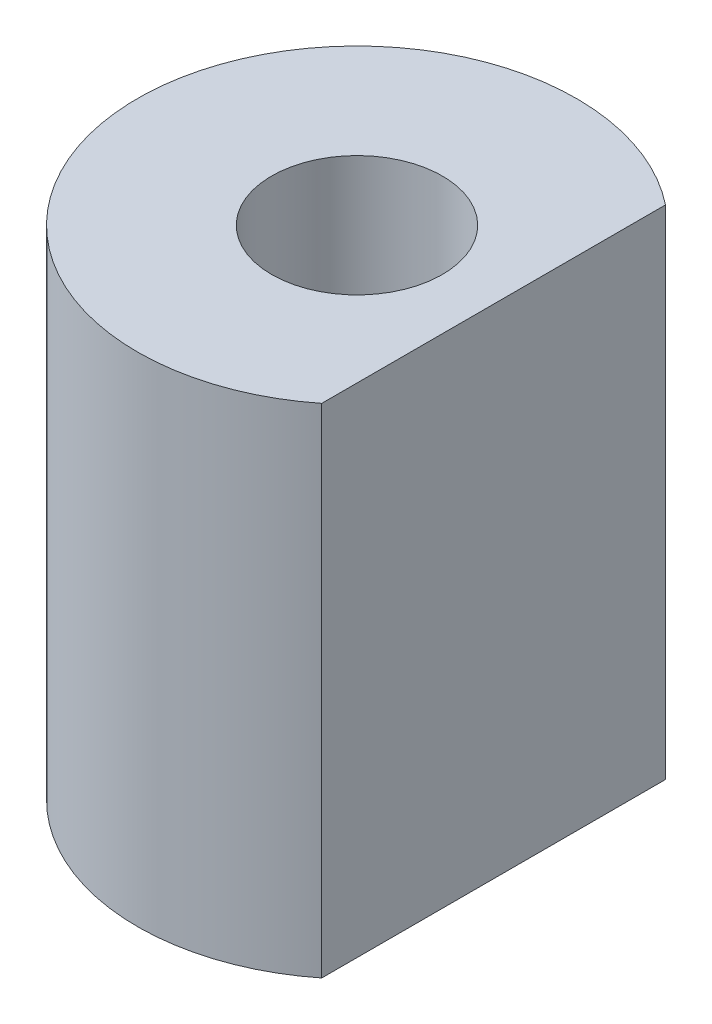
ISO-10303-21;
HEADER;
FILE_DESCRIPTION(('STEP AP214'),'2;1');
FILE_NAME('part.step','',(''),(''),'','','');
FILE_SCHEMA(('AUTOMOTIVE_DESIGN { 1 0 10303 214 1 1 1 1 }'));
ENDSEC;
DATA;
#1=APPLICATION_CONTEXT('core data for automotive mechanical design processes');
#2=APPLICATION_PROTOCOL_DEFINITION('international standard','automotive_design',2000,#1);
#3=PRODUCT_CONTEXT('',#1,'mechanical');
#4=PRODUCT('Part','Part','',(#3));
#5=PRODUCT_RELATED_PRODUCT_CATEGORY('part','',(#4));
#6=PRODUCT_DEFINITION_FORMATION('','',#4);
#7=PRODUCT_DEFINITION_CONTEXT('part definition',#1,'design');
#8=PRODUCT_DEFINITION('design','',#6,#7);
#9=PRODUCT_DEFINITION_SHAPE('','',#8);
#10=(LENGTH_UNIT() NAMED_UNIT(*) SI_UNIT(.MILLI.,.METRE.));
#11=(NAMED_UNIT(*) PLANE_ANGLE_UNIT() SI_UNIT($,.RADIAN.));
#12=(NAMED_UNIT(*) SI_UNIT($,.STERADIAN.) SOLID_ANGLE_UNIT());
#13=UNCERTAINTY_MEASURE_WITH_UNIT(LENGTH_MEASURE(1.E-05),#10,'distance_accuracy_value','');
#14=(GEOMETRIC_REPRESENTATION_CONTEXT(3) GLOBAL_UNCERTAINTY_ASSIGNED_CONTEXT((#13)) GLOBAL_UNIT_ASSIGNED_CONTEXT((#10,
#11,#12)) REPRESENTATION_CONTEXT('',''));
#15=CARTESIAN_POINT('',(0.,0.,0.));
#16=DIRECTION('',(0.,0.,1.));
#17=DIRECTION('',(1.,0.,0.));
#18=AXIS2_PLACEMENT_3D('',#15,#16,#17);
#19=CARTESIAN_POINT('',(2.8,10.2,0.));
#20=DIRECTION('',(1.,0.,0.));
#21=DIRECTION('',(0.,0.,-1.));
#22=AXIS2_PLACEMENT_3D('',#19,#20,#21);
#23=PLANE('',#22);
#24=DIRECTION('',(0.,0.,1.));
#25=VECTOR('',#24,1.);
#26=CARTESIAN_POINT('',(2.8,0.,0.));
#27=LINE('',#26,#25);
#28=CARTESIAN_POINT('',(2.8,0.,-3.52278299076171));
#29=VERTEX_POINT('',#28);
#30=CARTESIAN_POINT('',(2.8,0.,3.52278299076171));
#31=VERTEX_POINT('',#30);
#32=EDGE_CURVE('E70',#29,#31,#27,.T.);
#33=ORIENTED_EDGE('',*,*,#32,.F.);
#34=DIRECTION('',(0.,-1.,0.));
#35=VECTOR('',#34,1.);
#36=CARTESIAN_POINT('',(2.8,10.2,-3.52278299076171));
#37=LINE('',#36,#35);
#38=CARTESIAN_POINT('',(2.8,10.2,-3.52278299076171));
#39=VERTEX_POINT('',#38);
#40=EDGE_CURVE('E11',#39,#29,#37,.T.);
#41=ORIENTED_EDGE('',*,*,#40,.F.);
#42=DIRECTION('',(0.,0.,1.));
#43=VECTOR('',#42,1.);
#44=CARTESIAN_POINT('',(2.8,10.2,0.));
#45=LINE('',#44,#43);
#46=CARTESIAN_POINT('',(2.8,10.2,3.52278299076171));
#47=VERTEX_POINT('',#46);
#48=EDGE_CURVE('E71',#39,#47,#45,.T.);
#49=ORIENTED_EDGE('',*,*,#48,.T.);
#50=DIRECTION('',(0.,-1.,0.));
#51=VECTOR('',#50,1.);
#52=CARTESIAN_POINT('',(2.8,10.2,3.52278299076171));
#53=LINE('',#52,#51);
#54=EDGE_CURVE('E50',#47,#31,#53,.T.);
#55=ORIENTED_EDGE('',*,*,#54,.T.);
#56=EDGE_LOOP('',(#33,#41,#49,#55));
#57=FACE_BOUND('',#56,.T.);
#58=ADVANCED_FACE('F41',(#57),#23,.T.);
#59=CARTESIAN_POINT('',(0.,10.2,0.));
#60=DIRECTION('',(0.,-1.,0.));
#61=DIRECTION('',(0.,0.,-1.));
#62=AXIS2_PLACEMENT_3D('',#59,#60,#61);
#63=CYLINDRICAL_SURFACE('',#62,1.75);
#64=CARTESIAN_POINT('',(0.,10.2,0.));
#65=DIRECTION('',(0.,1.,0.));
#66=DIRECTION('',(0.,0.,1.));
#67=AXIS2_PLACEMENT_3D('',#64,#65,#66);
#68=CIRCLE('',#67,1.75);
#69=CARTESIAN_POINT('',(0.,10.2,1.75));
#70=VERTEX_POINT('',#69);
#71=EDGE_CURVE('E75',#70,#70,#68,.T.);
#72=ORIENTED_EDGE('',*,*,#71,.T.);
#73=EDGE_LOOP('',(#72));
#74=FACE_BOUND('',#73,.T.);
#75=CARTESIAN_POINT('',(0.,0.,0.));
#76=DIRECTION('',(0.,1.,0.));
#77=DIRECTION('',(0.,0.,1.));
#78=AXIS2_PLACEMENT_3D('',#75,#76,#77);
#79=CIRCLE('',#78,1.75);
#80=CARTESIAN_POINT('',(0.,0.,1.75));
#81=VERTEX_POINT('',#80);
#82=EDGE_CURVE('E78',#81,#81,#79,.T.);
#83=ORIENTED_EDGE('',*,*,#82,.F.);
#84=EDGE_LOOP('',(#83));
#85=FACE_BOUND('',#84,.T.);
#86=ADVANCED_FACE('F43',(#74,#85),#63,.F.);
#87=CARTESIAN_POINT('',(0.,10.2,0.));
#88=DIRECTION('',(0.,-1.,0.));
#89=DIRECTION('',(0.,0.,-1.));
#90=AXIS2_PLACEMENT_3D('',#87,#88,#89);
#91=CYLINDRICAL_SURFACE('',#90,4.5);
#92=CARTESIAN_POINT('',(0.,0.,0.));
#93=DIRECTION('',(0.,1.,0.));
#94=DIRECTION('',(0.,0.,1.));
#95=AXIS2_PLACEMENT_3D('',#92,#93,#94);
#96=CIRCLE('',#95,4.5);
#97=EDGE_CURVE('E72',#29,#31,#96,.T.);
#98=ORIENTED_EDGE('',*,*,#97,.T.);
#99=ORIENTED_EDGE('',*,*,#54,.F.);
#100=CARTESIAN_POINT('',(0.,10.2,0.));
#101=DIRECTION('',(0.,1.,0.));
#102=DIRECTION('',(0.,0.,1.));
#103=AXIS2_PLACEMENT_3D('',#100,#101,#102);
#104=CIRCLE('',#103,4.5);
#105=EDGE_CURVE('E57',#39,#47,#104,.T.);
#106=ORIENTED_EDGE('',*,*,#105,.F.);
#107=ORIENTED_EDGE('',*,*,#40,.T.);
#108=EDGE_LOOP('',(#98,#99,#106,#107));
#109=FACE_BOUND('',#108,.T.);
#110=ADVANCED_FACE('F73',(#109),#91,.T.);
#111=CARTESIAN_POINT('',(0.,10.2,0.));
#112=DIRECTION('',(0.,1.,0.));
#113=DIRECTION('',(0.,0.,1.));
#114=AXIS2_PLACEMENT_3D('',#111,#112,#113);
#115=PLANE('',#114);
#116=ORIENTED_EDGE('',*,*,#71,.F.);
#117=EDGE_LOOP('',(#116));
#118=FACE_BOUND('',#117,.T.);
#119=ORIENTED_EDGE('',*,*,#48,.F.);
#120=ORIENTED_EDGE('',*,*,#105,.T.);
#121=EDGE_LOOP('',(#119,#120));
#122=FACE_BOUND('',#121,.T.);
#123=ADVANCED_FACE('F90',(#118,#122),#115,.T.);
#124=CARTESIAN_POINT('',(0.,0.,0.));
#125=DIRECTION('',(0.,1.,0.));
#126=DIRECTION('',(0.,0.,1.));
#127=AXIS2_PLACEMENT_3D('',#124,#125,#126);
#128=PLANE('',#127);
#129=ORIENTED_EDGE('',*,*,#82,.T.);
#130=EDGE_LOOP('',(#129));
#131=FACE_BOUND('',#130,.T.);
#132=ORIENTED_EDGE('',*,*,#32,.T.);
#133=ORIENTED_EDGE('',*,*,#97,.F.);
#134=EDGE_LOOP('',(#132,#133));
#135=FACE_BOUND('',#134,.T.);
#136=ADVANCED_FACE('F77',(#131,#135),#128,.F.);
#137=CLOSED_SHELL('',(#58,#86,#110,#123,#136));
#138=MANIFOLD_SOLID_BREP('B2',#137);
#139=ADVANCED_BREP_SHAPE_REPRESENTATION('',(#18,#138),#14);
#140=SHAPE_DEFINITION_REPRESENTATION(#9,#139);
ENDSEC;
END-ISO-10303-21;
